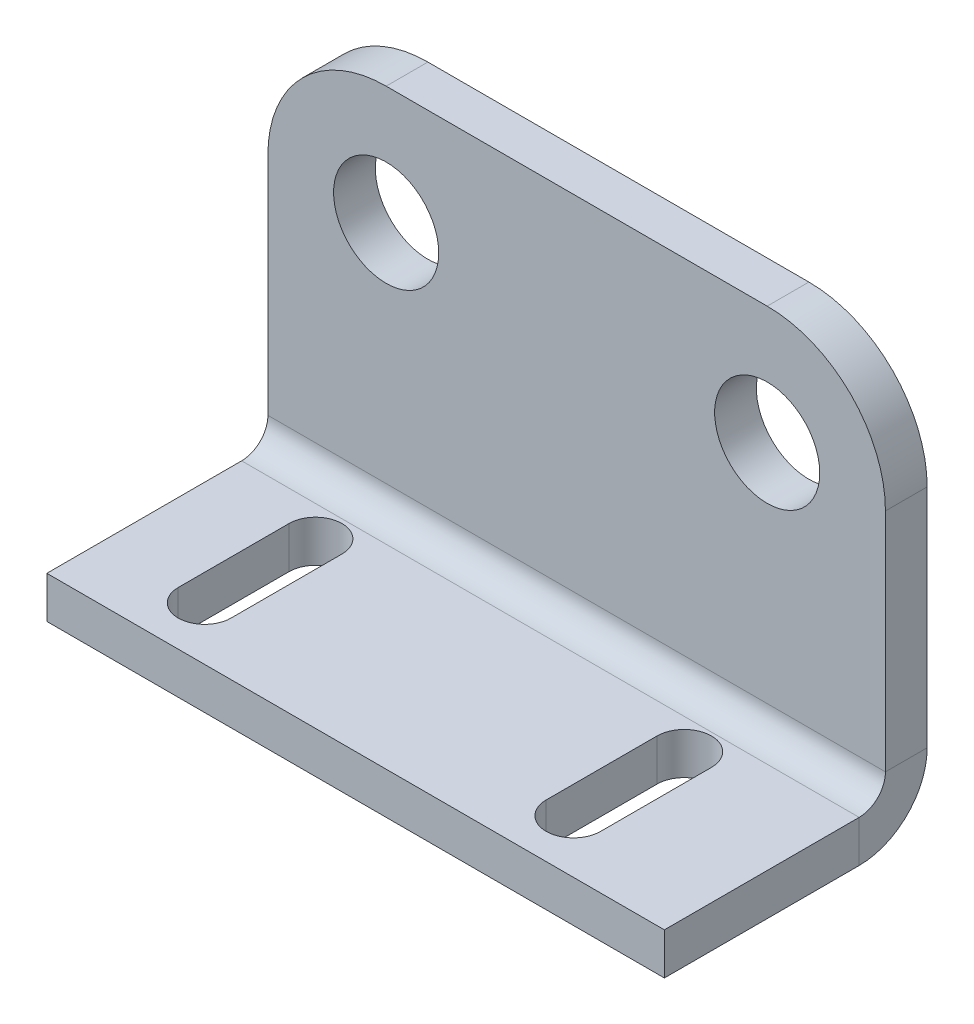
ISO-10303-21;
HEADER;
FILE_DESCRIPTION(('STEP AP214'),'2;1');
FILE_NAME('part.step','',(''),(''),'','','');
FILE_SCHEMA(('AUTOMOTIVE_DESIGN { 1 0 10303 214 1 1 1 1 }'));
ENDSEC;
DATA;
#1=APPLICATION_CONTEXT('core data for automotive mechanical design processes');
#2=APPLICATION_PROTOCOL_DEFINITION('international standard','automotive_design',2000,#1);
#3=PRODUCT_CONTEXT('',#1,'mechanical');
#4=PRODUCT('Part','Part','',(#3));
#5=PRODUCT_RELATED_PRODUCT_CATEGORY('part','',(#4));
#6=PRODUCT_DEFINITION_FORMATION('','',#4);
#7=PRODUCT_DEFINITION_CONTEXT('part definition',#1,'design');
#8=PRODUCT_DEFINITION('design','',#6,#7);
#9=PRODUCT_DEFINITION_SHAPE('','',#8);
#10=(LENGTH_UNIT() NAMED_UNIT(*) SI_UNIT(.MILLI.,.METRE.));
#11=(NAMED_UNIT(*) PLANE_ANGLE_UNIT() SI_UNIT($,.RADIAN.));
#12=(NAMED_UNIT(*) SI_UNIT($,.STERADIAN.) SOLID_ANGLE_UNIT());
#13=UNCERTAINTY_MEASURE_WITH_UNIT(LENGTH_MEASURE(1.E-05),#10,'distance_accuracy_value','');
#14=(GEOMETRIC_REPRESENTATION_CONTEXT(3) GLOBAL_UNCERTAINTY_ASSIGNED_CONTEXT((#13)) GLOBAL_UNIT_ASSIGNED_CONTEXT((#10,
#11,#12)) REPRESENTATION_CONTEXT('',''));
#15=CARTESIAN_POINT('',(0.,0.,0.));
#16=DIRECTION('',(0.,0.,1.));
#17=DIRECTION('',(1.,0.,0.));
#18=AXIS2_PLACEMENT_3D('',#15,#16,#17);
#19=CARTESIAN_POINT('',(31.2829174630816,-55.9298992856387,18.7536007121329));
#20=DIRECTION('',(0.,-1.,0.));
#21=DIRECTION('',(0.,0.,-1.));
#22=AXIS2_PLACEMENT_3D('',#19,#20,#21);
#23=CYLINDRICAL_SURFACE('',#22,5.18082831067459);
#24=DIRECTION('',(0.,-1.,0.));
#25=VECTOR('',#24,1.);
#26=CARTESIAN_POINT('',(36.4637457737562,-55.9298992856387,18.7536007121329));
#27=LINE('',#26,#25);
#28=CARTESIAN_POINT('',(36.4637457737562,-47.9923992856387,18.7536007121329));
#29=VERTEX_POINT('',#28);
#30=CARTESIAN_POINT('',(36.4637457737562,-55.9298992856387,18.7536007121329));
#31=VERTEX_POINT('',#30);
#32=EDGE_CURVE('E11',#29,#31,#27,.T.);
#33=ORIENTED_EDGE('',*,*,#32,.F.);
#34=CARTESIAN_POINT('',(31.2829174630816,-47.9923992856387,18.7536007121329));
#35=DIRECTION('',(0.,-1.,0.));
#36=DIRECTION('',(0.,0.,-1.));
#37=AXIS2_PLACEMENT_3D('',#34,#35,#36);
#38=CIRCLE('',#37,5.18082831067459);
#39=CARTESIAN_POINT('',(26.102089152407,-47.9923992856387,18.7536007121329));
#40=VERTEX_POINT('',#39);
#41=EDGE_CURVE('E141',#40,#29,#38,.T.);
#42=ORIENTED_EDGE('',*,*,#41,.F.);
#43=DIRECTION('',(0.,-1.,0.));
#44=VECTOR('',#43,1.);
#45=CARTESIAN_POINT('',(26.102089152407,-55.9298992856387,18.7536007121329));
#46=LINE('',#45,#44);
#47=CARTESIAN_POINT('',(26.102089152407,-55.9298992856387,18.7536007121329));
#48=VERTEX_POINT('',#47);
#49=EDGE_CURVE('E51',#40,#48,#46,.T.);
#50=ORIENTED_EDGE('',*,*,#49,.T.);
#51=CARTESIAN_POINT('',(31.2829174630816,-55.9298992856387,18.7536007121329));
#52=DIRECTION('',(0.,-1.,0.));
#53=DIRECTION('',(0.,0.,-1.));
#54=AXIS2_PLACEMENT_3D('',#51,#52,#53);
#55=CIRCLE('',#54,5.18082831067459);
#56=EDGE_CURVE('E202',#48,#31,#55,.T.);
#57=ORIENTED_EDGE('',*,*,#56,.T.);
#58=EDGE_LOOP('',(#33,#42,#50,#57));
#59=FACE_BOUND('',#58,.T.);
#60=ADVANCED_FACE('F41',(#59),#23,.F.);
#61=CARTESIAN_POINT('',(26.102089152407,-55.9298992856387,39.8450791079031));
#62=DIRECTION('',(1.,0.,0.));
#63=DIRECTION('',(0.,0.,-1.));
#64=AXIS2_PLACEMENT_3D('',#61,#62,#63);
#65=PLANE('',#64);
#66=ORIENTED_EDGE('',*,*,#49,.F.);
#67=DIRECTION('',(0.,0.,1.));
#68=VECTOR('',#67,1.);
#69=CARTESIAN_POINT('',(26.102089152407,-47.9923992856387,0.));
#70=LINE('',#69,#68);
#71=CARTESIAN_POINT('',(26.102089152407,-47.9923992856387,39.8450791079031));
#72=VERTEX_POINT('',#71);
#73=EDGE_CURVE('E154',#72,#40,#70,.F.);
#74=ORIENTED_EDGE('',*,*,#73,.F.);
#75=DIRECTION('',(0.,-1.,0.));
#76=VECTOR('',#75,1.);
#77=CARTESIAN_POINT('',(26.102089152407,-55.9298992856387,39.8450791079031));
#78=LINE('',#77,#76);
#79=CARTESIAN_POINT('',(26.102089152407,-55.9298992856387,39.8450791079031));
#80=VERTEX_POINT('',#79);
#81=EDGE_CURVE('E133',#72,#80,#78,.T.);
#82=ORIENTED_EDGE('',*,*,#81,.T.);
#83=DIRECTION('',(0.,0.,-1.));
#84=VECTOR('',#83,1.);
#85=CARTESIAN_POINT('',(26.102089152407,-55.9298992856387,39.8450791079031));
#86=LINE('',#85,#84);
#87=EDGE_CURVE('E210',#80,#48,#86,.T.);
#88=ORIENTED_EDGE('',*,*,#87,.T.);
#89=EDGE_LOOP('',(#66,#74,#82,#88));
#90=FACE_BOUND('',#89,.T.);
#91=ADVANCED_FACE('F212',(#90),#65,.T.);
#92=CARTESIAN_POINT('',(31.2829174630816,-55.9298992856387,39.8450791079031));
#93=DIRECTION('',(0.,-1.,0.));
#94=DIRECTION('',(0.,0.,-1.));
#95=AXIS2_PLACEMENT_3D('',#92,#93,#94);
#96=CYLINDRICAL_SURFACE('',#95,5.18082831067459);
#97=ORIENTED_EDGE('',*,*,#81,.F.);
#98=CARTESIAN_POINT('',(31.2829174630816,-47.9923992856387,39.8450791079031));
#99=DIRECTION('',(0.,-1.,0.));
#100=DIRECTION('',(0.,0.,-1.));
#101=AXIS2_PLACEMENT_3D('',#98,#99,#100);
#102=CIRCLE('',#101,5.18082831067459);
#103=CARTESIAN_POINT('',(36.4637457737562,-47.9923992856387,39.8450791079031));
#104=VERTEX_POINT('',#103);
#105=EDGE_CURVE('E139',#104,#72,#102,.T.);
#106=ORIENTED_EDGE('',*,*,#105,.F.);
#107=DIRECTION('',(0.,-1.,0.));
#108=VECTOR('',#107,1.);
#109=CARTESIAN_POINT('',(36.4637457737562,-55.9298992856387,39.8450791079031));
#110=LINE('',#109,#108);
#111=CARTESIAN_POINT('',(36.4637457737562,-55.9298992856387,39.8450791079031));
#112=VERTEX_POINT('',#111);
#113=EDGE_CURVE('E45',#104,#112,#110,.T.);
#114=ORIENTED_EDGE('',*,*,#113,.T.);
#115=CARTESIAN_POINT('',(31.2829174630816,-55.9298992856387,39.8450791079031));
#116=DIRECTION('',(0.,-1.,0.));
#117=DIRECTION('',(0.,0.,-1.));
#118=AXIS2_PLACEMENT_3D('',#115,#116,#117);
#119=CIRCLE('',#118,5.18082831067459);
#120=EDGE_CURVE('E382',#112,#80,#119,.T.);
#121=ORIENTED_EDGE('',*,*,#120,.T.);
#122=EDGE_LOOP('',(#97,#106,#114,#121));
#123=FACE_BOUND('',#122,.T.);
#124=ADVANCED_FACE('F143',(#123),#96,.F.);
#125=CARTESIAN_POINT('',(-38.8803002300545,-55.9298992856387,18.7536007121329));
#126=DIRECTION('',(0.,-1.,0.));
#127=DIRECTION('',(0.,0.,-1.));
#128=AXIS2_PLACEMENT_3D('',#125,#126,#127);
#129=CYLINDRICAL_SURFACE('',#128,5.03280464465532);
#130=DIRECTION('',(0.,-1.,0.));
#131=VECTOR('',#130,1.);
#132=CARTESIAN_POINT('',(-33.8474955853992,-55.9298992856387,18.7536007121329));
#133=LINE('',#132,#131);
#134=CARTESIAN_POINT('',(-33.8474955853992,-47.9923992856387,18.7536007121329));
#135=VERTEX_POINT('',#134);
#136=CARTESIAN_POINT('',(-33.8474955853992,-55.9298992856387,18.7536007121329));
#137=VERTEX_POINT('',#136);
#138=EDGE_CURVE('E134',#135,#137,#133,.T.);
#139=ORIENTED_EDGE('',*,*,#138,.F.);
#140=CARTESIAN_POINT('',(-38.8803002300545,-47.9923992856387,18.7536007121329));
#141=DIRECTION('',(0.,-1.,0.));
#142=DIRECTION('',(0.,0.,-1.));
#143=AXIS2_PLACEMENT_3D('',#140,#141,#142);
#144=CIRCLE('',#143,5.03280464465532);
#145=CARTESIAN_POINT('',(-43.9131048747098,-47.9923992856387,18.7536007121329));
#146=VERTEX_POINT('',#145);
#147=EDGE_CURVE('E289',#146,#135,#144,.T.);
#148=ORIENTED_EDGE('',*,*,#147,.F.);
#149=DIRECTION('',(0.,-1.,0.));
#150=VECTOR('',#149,1.);
#151=CARTESIAN_POINT('',(-43.9131048747098,-55.9298992856387,18.7536007121329));
#152=LINE('',#151,#150);
#153=CARTESIAN_POINT('',(-43.9131048747098,-55.9298992856387,18.7536007121329));
#154=VERTEX_POINT('',#153);
#155=EDGE_CURVE('E190',#146,#154,#152,.T.);
#156=ORIENTED_EDGE('',*,*,#155,.T.);
#157=CARTESIAN_POINT('',(-38.8803002300545,-55.9298992856387,18.7536007121329));
#158=DIRECTION('',(0.,-1.,0.));
#159=DIRECTION('',(0.,0.,-1.));
#160=AXIS2_PLACEMENT_3D('',#157,#158,#159);
#161=CIRCLE('',#160,5.03280464465532);
#162=EDGE_CURVE('E387',#154,#137,#161,.T.);
#163=ORIENTED_EDGE('',*,*,#162,.T.);
#164=EDGE_LOOP('',(#139,#148,#156,#163));
#165=FACE_BOUND('',#164,.T.);
#166=ADVANCED_FACE('F399',(#165),#129,.F.);
#167=CARTESIAN_POINT('',(-43.9131048747098,-55.9298992856387,39.8450791079031));
#168=DIRECTION('',(1.,0.,0.));
#169=DIRECTION('',(0.,0.,-1.));
#170=AXIS2_PLACEMENT_3D('',#167,#168,#169);
#171=PLANE('',#170);
#172=ORIENTED_EDGE('',*,*,#155,.F.);
#173=DIRECTION('',(0.,0.,1.));
#174=VECTOR('',#173,1.);
#175=CARTESIAN_POINT('',(-43.9131048747098,-47.9923992856387,0.));
#176=LINE('',#175,#174);
#177=CARTESIAN_POINT('',(-43.9131048747098,-47.9923992856387,39.8450791079031));
#178=VERTEX_POINT('',#177);
#179=EDGE_CURVE('E276',#178,#146,#176,.F.);
#180=ORIENTED_EDGE('',*,*,#179,.F.);
#181=DIRECTION('',(0.,-1.,0.));
#182=VECTOR('',#181,1.);
#183=CARTESIAN_POINT('',(-43.9131048747098,-55.9298992856387,39.8450791079031));
#184=LINE('',#183,#182);
#185=CARTESIAN_POINT('',(-43.9131048747098,-55.9298992856387,39.8450791079031));
#186=VERTEX_POINT('',#185);
#187=EDGE_CURVE('E187',#178,#186,#184,.T.);
#188=ORIENTED_EDGE('',*,*,#187,.T.);
#189=DIRECTION('',(0.,0.,-1.));
#190=VECTOR('',#189,1.);
#191=CARTESIAN_POINT('',(-43.9131048747098,-55.9298992856387,39.8450791079031));
#192=LINE('',#191,#190);
#193=EDGE_CURVE('E309',#186,#154,#192,.T.);
#194=ORIENTED_EDGE('',*,*,#193,.T.);
#195=EDGE_LOOP('',(#172,#180,#188,#194));
#196=FACE_BOUND('',#195,.T.);
#197=ADVANCED_FACE('F307',(#196),#171,.T.);
#198=CARTESIAN_POINT('',(-38.8803002300545,-55.9298992856387,39.8450791079031));
#199=DIRECTION('',(0.,-1.,0.));
#200=DIRECTION('',(0.,0.,-1.));
#201=AXIS2_PLACEMENT_3D('',#198,#199,#200);
#202=CYLINDRICAL_SURFACE('',#201,5.03280464465532);
#203=ORIENTED_EDGE('',*,*,#187,.F.);
#204=CARTESIAN_POINT('',(-38.8803002300545,-47.9923992856387,39.8450791079031));
#205=DIRECTION('',(0.,-1.,0.));
#206=DIRECTION('',(0.,0.,-1.));
#207=AXIS2_PLACEMENT_3D('',#204,#205,#206);
#208=CIRCLE('',#207,5.03280464465532);
#209=CARTESIAN_POINT('',(-33.8474955853992,-47.9923992856387,39.8450791079031));
#210=VERTEX_POINT('',#209);
#211=EDGE_CURVE('E272',#210,#178,#208,.T.);
#212=ORIENTED_EDGE('',*,*,#211,.F.);
#213=DIRECTION('',(0.,-1.,0.));
#214=VECTOR('',#213,1.);
#215=CARTESIAN_POINT('',(-33.8474955853992,-55.9298992856387,39.8450791079031));
#216=LINE('',#215,#214);
#217=CARTESIAN_POINT('',(-33.8474955853992,-55.9298992856387,39.8450791079031));
#218=VERTEX_POINT('',#217);
#219=EDGE_CURVE('E184',#210,#218,#216,.T.);
#220=ORIENTED_EDGE('',*,*,#219,.T.);
#221=CARTESIAN_POINT('',(-38.8803002300545,-55.9298992856387,39.8450791079031));
#222=DIRECTION('',(0.,-1.,0.));
#223=DIRECTION('',(0.,0.,-1.));
#224=AXIS2_PLACEMENT_3D('',#221,#222,#223);
#225=CIRCLE('',#224,5.03280464465532);
#226=EDGE_CURVE('E248',#218,#186,#225,.T.);
#227=ORIENTED_EDGE('',*,*,#226,.T.);
#228=EDGE_LOOP('',(#203,#212,#220,#227));
#229=FACE_BOUND('',#228,.T.);
#230=ADVANCED_FACE('F300',(#229),#202,.F.);
#231=CARTESIAN_POINT('',(58.75,-55.9298992856387,0.));
#232=DIRECTION('',(-1.,0.,0.));
#233=DIRECTION('',(0.,0.,1.));
#234=AXIS2_PLACEMENT_3D('',#231,#232,#233);
#235=PLANE('',#234);
#236=DIRECTION('',(0.,-1.,0.));
#237=VECTOR('',#236,1.);
#238=CARTESIAN_POINT('',(58.75,-55.9298992856387,12.9375));
#239=LINE('',#238,#237);
#240=CARTESIAN_POINT('',(58.75,-47.9923992856387,12.9375));
#241=VERTEX_POINT('',#240);
#242=CARTESIAN_POINT('',(58.75,-55.9298992856387,12.9375));
#243=VERTEX_POINT('',#242);
#244=EDGE_CURVE('E181',#241,#243,#239,.T.);
#245=ORIENTED_EDGE('',*,*,#244,.F.);
#246=DIRECTION('',(0.,0.,1.));
#247=VECTOR('',#246,1.);
#248=CARTESIAN_POINT('',(58.75,-47.9923992856387,0.));
#249=LINE('',#248,#247);
#250=CARTESIAN_POINT('',(58.75,-47.9923992856387,50.));
#251=VERTEX_POINT('',#250);
#252=EDGE_CURVE('E148',#241,#251,#249,.T.);
#253=ORIENTED_EDGE('',*,*,#252,.T.);
#254=DIRECTION('',(0.,-1.,0.));
#255=VECTOR('',#254,1.);
#256=CARTESIAN_POINT('',(58.75,-55.9298992856387,50.));
#257=LINE('',#256,#255);
#258=CARTESIAN_POINT('',(58.75,-55.9298992856387,50.));
#259=VERTEX_POINT('',#258);
#260=EDGE_CURVE('E178',#251,#259,#257,.T.);
#261=ORIENTED_EDGE('',*,*,#260,.T.);
#262=DIRECTION('',(0.,0.,1.));
#263=VECTOR('',#262,1.);
#264=CARTESIAN_POINT('',(58.75,-55.9298992856387,0.));
#265=LINE('',#264,#263);
#266=EDGE_CURVE('E342',#243,#259,#265,.T.);
#267=ORIENTED_EDGE('',*,*,#266,.F.);
#268=EDGE_LOOP('',(#245,#253,#261,#267));
#269=FACE_BOUND('',#268,.T.);
#270=ADVANCED_FACE('F343',(#269),#235,.F.);
#271=CARTESIAN_POINT('',(-58.75,-55.9298992856387,50.));
#272=DIRECTION('',(0.,0.,-1.));
#273=DIRECTION('',(-1.,0.,0.));
#274=AXIS2_PLACEMENT_3D('',#271,#272,#273);
#275=PLANE('',#274);
#276=ORIENTED_EDGE('',*,*,#260,.F.);
#277=DIRECTION('',(1.,0.,0.));
#278=VECTOR('',#277,1.);
#279=CARTESIAN_POINT('',(0.,-47.9923992856387,50.));
#280=LINE('',#279,#278);
#281=CARTESIAN_POINT('',(-58.75,-47.9923992856387,50.));
#282=VERTEX_POINT('',#281);
#283=EDGE_CURVE('E145',#251,#282,#280,.F.);
#284=ORIENTED_EDGE('',*,*,#283,.T.);
#285=DIRECTION('',(0.,-1.,0.));
#286=VECTOR('',#285,1.);
#287=CARTESIAN_POINT('',(-58.75,-55.9298992856387,50.));
#288=LINE('',#287,#286);
#289=CARTESIAN_POINT('',(-58.75,-55.9298992856387,50.));
#290=VERTEX_POINT('',#289);
#291=EDGE_CURVE('E175',#282,#290,#288,.T.);
#292=ORIENTED_EDGE('',*,*,#291,.T.);
#293=DIRECTION('',(-1.,0.,0.));
#294=VECTOR('',#293,1.);
#295=CARTESIAN_POINT('',(-58.75,-55.9298992856387,50.));
#296=LINE('',#295,#294);
#297=EDGE_CURVE('E347',#259,#290,#296,.T.);
#298=ORIENTED_EDGE('',*,*,#297,.F.);
#299=EDGE_LOOP('',(#276,#284,#292,#298));
#300=FACE_BOUND('',#299,.T.);
#301=ADVANCED_FACE('F381',(#300),#275,.F.);
#302=CARTESIAN_POINT('',(-58.75,-55.9298992856387,0.));
#303=DIRECTION('',(1.,0.,0.));
#304=DIRECTION('',(0.,0.,-1.));
#305=AXIS2_PLACEMENT_3D('',#302,#303,#304);
#306=PLANE('',#305);
#307=ORIENTED_EDGE('',*,*,#291,.F.);
#308=DIRECTION('',(0.,0.,1.));
#309=VECTOR('',#308,1.);
#310=CARTESIAN_POINT('',(-58.75,-47.9923992856387,0.));
#311=LINE('',#310,#309);
#312=CARTESIAN_POINT('',(-58.75,-47.9923992856387,12.9375));
#313=VERTEX_POINT('',#312);
#314=EDGE_CURVE('E274',#282,#313,#311,.F.);
#315=ORIENTED_EDGE('',*,*,#314,.T.);
#316=DIRECTION('',(0.,-1.,0.));
#317=VECTOR('',#316,1.);
#318=CARTESIAN_POINT('',(-58.75,-55.9298992856387,12.9375));
#319=LINE('',#318,#317);
#320=CARTESIAN_POINT('',(-58.75,-55.9298992856387,12.9375));
#321=VERTEX_POINT('',#320);
#322=EDGE_CURVE('E172',#313,#321,#319,.T.);
#323=ORIENTED_EDGE('',*,*,#322,.T.);
#324=DIRECTION('',(0.,0.,-1.));
#325=VECTOR('',#324,1.);
#326=CARTESIAN_POINT('',(-58.75,-55.9298992856387,0.));
#327=LINE('',#326,#325);
#328=EDGE_CURVE('E348',#290,#321,#327,.T.);
#329=ORIENTED_EDGE('',*,*,#328,.F.);
#330=EDGE_LOOP('',(#307,#315,#323,#329));
#331=FACE_BOUND('',#330,.T.);
#332=ADVANCED_FACE('F441',(#331),#306,.F.);
#333=CARTESIAN_POINT('',(-58.75,-42.9923992856387,12.9375));
#334=DIRECTION('',(-1.,0.,0.));
#335=DIRECTION('',(0.,-1.,0.));
#336=AXIS2_PLACEMENT_3D('',#333,#334,#335);
#337=PLANE('',#336);
#338=ORIENTED_EDGE('',*,*,#322,.F.);
#339=CARTESIAN_POINT('',(-58.75,-42.9923992856387,12.9375));
#340=DIRECTION('',(1.,0.,0.));
#341=DIRECTION('',(0.,0.,-1.));
#342=AXIS2_PLACEMENT_3D('',#339,#340,#341);
#343=CIRCLE('',#342,5.);
#344=CARTESIAN_POINT('',(-58.75,-42.9923992856387,7.9375));
#345=VERTEX_POINT('',#344);
#346=EDGE_CURVE('E270',#313,#345,#343,.T.);
#347=ORIENTED_EDGE('',*,*,#346,.T.);
#348=DIRECTION('',(0.,0.,-1.));
#349=VECTOR('',#348,1.);
#350=CARTESIAN_POINT('',(-58.75,-42.9923992856387,0.));
#351=LINE('',#350,#349);
#352=CARTESIAN_POINT('',(-58.75,-42.9923992856387,0.));
#353=VERTEX_POINT('',#352);
#354=EDGE_CURVE('E59',#345,#353,#351,.T.);
#355=ORIENTED_EDGE('',*,*,#354,.T.);
#356=CARTESIAN_POINT('',(-58.75,-42.9923992856387,12.9375));
#357=DIRECTION('',(1.,0.,0.));
#358=DIRECTION('',(0.,1.,0.));
#359=AXIS2_PLACEMENT_3D('',#356,#357,#358);
#360=CIRCLE('',#359,12.9375);
#361=EDGE_CURVE('E245',#321,#353,#360,.T.);
#362=ORIENTED_EDGE('',*,*,#361,.F.);
#363=EDGE_LOOP('',(#338,#347,#355,#362));
#364=FACE_BOUND('',#363,.T.);
#365=ADVANCED_FACE('F354',(#364),#337,.T.);
#366=CARTESIAN_POINT('',(-58.75,0.,0.));
#367=DIRECTION('',(-1.,0.,0.));
#368=DIRECTION('',(0.,-1.,0.));
#369=AXIS2_PLACEMENT_3D('',#366,#367,#368);
#370=PLANE('',#369);
#371=ORIENTED_EDGE('',*,*,#354,.F.);
#372=DIRECTION('',(0.,1.,0.));
#373=VECTOR('',#372,1.);
#374=CARTESIAN_POINT('',(-58.75,0.,7.9375));
#375=LINE('',#374,#373);
#376=CARTESIAN_POINT('',(-58.75,0.,7.9375));
#377=VERTEX_POINT('',#376);
#378=EDGE_CURVE('E258',#377,#345,#375,.F.);
#379=ORIENTED_EDGE('',*,*,#378,.F.);
#380=DIRECTION('',(0.,0.,-1.));
#381=VECTOR('',#380,1.);
#382=CARTESIAN_POINT('',(-58.75,0.,0.));
#383=LINE('',#382,#381);
#384=CARTESIAN_POINT('',(-58.75,0.,0.));
#385=VERTEX_POINT('',#384);
#386=EDGE_CURVE('E168',#377,#385,#383,.T.);
#387=ORIENTED_EDGE('',*,*,#386,.T.);
#388=DIRECTION('',(0.,-1.,0.));
#389=VECTOR('',#388,1.);
#390=CARTESIAN_POINT('',(-58.75,0.,0.));
#391=LINE('',#390,#389);
#392=EDGE_CURVE('E225',#385,#353,#391,.T.);
#393=ORIENTED_EDGE('',*,*,#392,.T.);
#394=EDGE_LOOP('',(#371,#379,#387,#393));
#395=FACE_BOUND('',#394,.T.);
#396=ADVANCED_FACE('F358',(#395),#370,.T.);
#397=CARTESIAN_POINT('',(-36.25,0.,0.));
#398=DIRECTION('',(0.,0.,1.));
#399=DIRECTION('',(1.,0.,0.));
#400=AXIS2_PLACEMENT_3D('',#397,#398,#399);
#401=CYLINDRICAL_SURFACE('',#400,22.5);
#402=ORIENTED_EDGE('',*,*,#386,.F.);
#403=CARTESIAN_POINT('',(-36.25,0.,7.9375));
#404=DIRECTION('',(0.,0.,1.));
#405=DIRECTION('',(1.,0.,0.));
#406=AXIS2_PLACEMENT_3D('',#403,#404,#405);
#407=CIRCLE('',#406,22.5);
#408=CARTESIAN_POINT('',(-36.25,22.5,7.9375));
#409=VERTEX_POINT('',#408);
#410=EDGE_CURVE('E264',#409,#377,#407,.T.);
#411=ORIENTED_EDGE('',*,*,#410,.F.);
#412=DIRECTION('',(0.,0.,-1.));
#413=VECTOR('',#412,1.);
#414=CARTESIAN_POINT('',(-36.25,22.5,0.));
#415=LINE('',#414,#413);
#416=CARTESIAN_POINT('',(-36.25,22.5,0.));
#417=VERTEX_POINT('',#416);
#418=EDGE_CURVE('E165',#409,#417,#415,.T.);
#419=ORIENTED_EDGE('',*,*,#418,.T.);
#420=CARTESIAN_POINT('',(-36.25,0.,0.));
#421=DIRECTION('',(0.,0.,1.));
#422=DIRECTION('',(1.,0.,0.));
#423=AXIS2_PLACEMENT_3D('',#420,#421,#422);
#424=CIRCLE('',#423,22.5);
#425=EDGE_CURVE('E228',#417,#385,#424,.T.);
#426=ORIENTED_EDGE('',*,*,#425,.T.);
#427=EDGE_LOOP('',(#402,#411,#419,#426));
#428=FACE_BOUND('',#427,.T.);
#429=ADVANCED_FACE('F432',(#428),#401,.T.);
#430=CARTESIAN_POINT('',(0.,22.5,0.));
#431=DIRECTION('',(0.,-1.,0.));
#432=DIRECTION('',(1.,0.,0.));
#433=AXIS2_PLACEMENT_3D('',#430,#431,#432);
#434=PLANE('',#433);
#435=ORIENTED_EDGE('',*,*,#418,.F.);
#436=DIRECTION('',(1.,0.,0.));
#437=VECTOR('',#436,1.);
#438=CARTESIAN_POINT('',(0.,22.5,7.9375));
#439=LINE('',#438,#437);
#440=CARTESIAN_POINT('',(36.25,22.5,7.9375));
#441=VERTEX_POINT('',#440);
#442=EDGE_CURVE('E156',#409,#441,#439,.T.);
#443=ORIENTED_EDGE('',*,*,#442,.T.);
#444=DIRECTION('',(0.,0.,-1.));
#445=VECTOR('',#444,1.);
#446=CARTESIAN_POINT('',(36.25,22.5,0.));
#447=LINE('',#446,#445);
#448=CARTESIAN_POINT('',(36.25,22.5,0.));
#449=VERTEX_POINT('',#448);
#450=EDGE_CURVE('E161',#441,#449,#447,.T.);
#451=ORIENTED_EDGE('',*,*,#450,.T.);
#452=DIRECTION('',(1.,0.,0.));
#453=VECTOR('',#452,1.);
#454=CARTESIAN_POINT('',(0.,22.5,0.));
#455=LINE('',#454,#453);
#456=EDGE_CURVE('E213',#417,#449,#455,.T.);
#457=ORIENTED_EDGE('',*,*,#456,.F.);
#458=EDGE_LOOP('',(#435,#443,#451,#457));
#459=FACE_BOUND('',#458,.T.);
#460=ADVANCED_FACE('F424',(#459),#434,.F.);
#461=CARTESIAN_POINT('',(36.25,0.,0.));
#462=DIRECTION('',(0.,0.,1.));
#463=DIRECTION('',(1.,0.,0.));
#464=AXIS2_PLACEMENT_3D('',#461,#462,#463);
#465=CYLINDRICAL_SURFACE('',#464,22.5);
#466=ORIENTED_EDGE('',*,*,#450,.F.);
#467=CARTESIAN_POINT('',(36.25,0.,7.9375));
#468=DIRECTION('',(0.,0.,1.));
#469=DIRECTION('',(1.,0.,0.));
#470=AXIS2_PLACEMENT_3D('',#467,#468,#469);
#471=CIRCLE('',#470,22.5);
#472=CARTESIAN_POINT('',(58.75,0.,7.9375));
#473=VERTEX_POINT('',#472);
#474=EDGE_CURVE('E259',#473,#441,#471,.T.);
#475=ORIENTED_EDGE('',*,*,#474,.F.);
#476=DIRECTION('',(0.,0.,-1.));
#477=VECTOR('',#476,1.);
#478=CARTESIAN_POINT('',(58.75,0.,0.));
#479=LINE('',#478,#477);
#480=CARTESIAN_POINT('',(58.75,0.,0.));
#481=VERTEX_POINT('',#480);
#482=EDGE_CURVE('E158',#473,#481,#479,.T.);
#483=ORIENTED_EDGE('',*,*,#482,.T.);
#484=CARTESIAN_POINT('',(36.25,0.,0.));
#485=DIRECTION('',(0.,0.,1.));
#486=DIRECTION('',(1.,0.,0.));
#487=AXIS2_PLACEMENT_3D('',#484,#485,#486);
#488=CIRCLE('',#487,22.5);
#489=EDGE_CURVE('E216',#481,#449,#488,.T.);
#490=ORIENTED_EDGE('',*,*,#489,.T.);
#491=EDGE_LOOP('',(#466,#475,#483,#490));
#492=FACE_BOUND('',#491,.T.);
#493=ADVANCED_FACE('F419',(#492),#465,.T.);
#494=CARTESIAN_POINT('',(58.75,0.,0.));
#495=DIRECTION('',(-1.,0.,0.));
#496=DIRECTION('',(0.,-1.,0.));
#497=AXIS2_PLACEMENT_3D('',#494,#495,#496);
#498=PLANE('',#497);
#499=ORIENTED_EDGE('',*,*,#482,.F.);
#500=DIRECTION('',(0.,1.,0.));
#501=VECTOR('',#500,1.);
#502=CARTESIAN_POINT('',(58.75,0.,7.9375));
#503=LINE('',#502,#501);
#504=CARTESIAN_POINT('',(58.75,-42.9923992856387,7.9375));
#505=VERTEX_POINT('',#504);
#506=EDGE_CURVE('E255',#473,#505,#503,.F.);
#507=ORIENTED_EDGE('',*,*,#506,.T.);
#508=DIRECTION('',(0.,0.,-1.));
#509=VECTOR('',#508,1.);
#510=CARTESIAN_POINT('',(58.75,-42.9923992856387,0.));
#511=LINE('',#510,#509);
#512=CARTESIAN_POINT('',(58.75,-42.9923992856387,0.));
#513=VERTEX_POINT('',#512);
#514=EDGE_CURVE('E162',#505,#513,#511,.T.);
#515=ORIENTED_EDGE('',*,*,#514,.T.);
#516=DIRECTION('',(0.,-1.,0.));
#517=VECTOR('',#516,1.);
#518=CARTESIAN_POINT('',(58.75,0.,0.));
#519=LINE('',#518,#517);
#520=EDGE_CURVE('E222',#481,#513,#519,.T.);
#521=ORIENTED_EDGE('',*,*,#520,.F.);
#522=EDGE_LOOP('',(#499,#507,#515,#521));
#523=FACE_BOUND('',#522,.T.);
#524=ADVANCED_FACE('F367',(#523),#498,.F.);
#525=CARTESIAN_POINT('',(-33.8474955853992,-55.9298992856387,39.8450791079031));
#526=DIRECTION('',(-1.,0.,0.));
#527=DIRECTION('',(0.,0.,1.));
#528=AXIS2_PLACEMENT_3D('',#525,#526,#527);
#529=PLANE('',#528);
#530=DIRECTION('',(0.,0.,1.));
#531=VECTOR('',#530,1.);
#532=CARTESIAN_POINT('',(-33.8474955853992,-47.9923992856387,0.));
#533=LINE('',#532,#531);
#534=EDGE_CURVE('E152',#135,#210,#533,.T.);
#535=ORIENTED_EDGE('',*,*,#534,.F.);
#536=ORIENTED_EDGE('',*,*,#138,.T.);
#537=DIRECTION('',(0.,0.,1.));
#538=VECTOR('',#537,1.);
#539=CARTESIAN_POINT('',(-33.8474955853992,-55.9298992856387,39.8450791079031));
#540=LINE('',#539,#538);
#541=EDGE_CURVE('E390',#137,#218,#540,.T.);
#542=ORIENTED_EDGE('',*,*,#541,.T.);
#543=ORIENTED_EDGE('',*,*,#219,.F.);
#544=EDGE_LOOP('',(#535,#536,#542,#543));
#545=FACE_BOUND('',#544,.T.);
#546=ADVANCED_FACE('F394',(#545),#529,.T.);
#547=CARTESIAN_POINT('',(36.4637457737562,-55.9298992856387,39.8450791079031));
#548=DIRECTION('',(-1.,0.,0.));
#549=DIRECTION('',(0.,0.,1.));
#550=AXIS2_PLACEMENT_3D('',#547,#548,#549);
#551=PLANE('',#550);
#552=DIRECTION('',(0.,0.,1.));
#553=VECTOR('',#552,1.);
#554=CARTESIAN_POINT('',(36.4637457737562,-47.9923992856387,0.));
#555=LINE('',#554,#553);
#556=EDGE_CURVE('E125',#29,#104,#555,.T.);
#557=ORIENTED_EDGE('',*,*,#556,.F.);
#558=ORIENTED_EDGE('',*,*,#32,.T.);
#559=DIRECTION('',(0.,0.,1.));
#560=VECTOR('',#559,1.);
#561=CARTESIAN_POINT('',(36.4637457737562,-55.9298992856387,39.8450791079031));
#562=LINE('',#561,#560);
#563=EDGE_CURVE('E128',#31,#112,#562,.T.);
#564=ORIENTED_EDGE('',*,*,#563,.T.);
#565=ORIENTED_EDGE('',*,*,#113,.F.);
#566=EDGE_LOOP('',(#557,#558,#564,#565));
#567=FACE_BOUND('',#566,.T.);
#568=ADVANCED_FACE('F43',(#567),#551,.T.);
#569=CARTESIAN_POINT('',(58.75,-42.9923992856387,12.9375));
#570=DIRECTION('',(-1.,0.,0.));
#571=DIRECTION('',(0.,-1.,0.));
#572=AXIS2_PLACEMENT_3D('',#569,#570,#571);
#573=PLANE('',#572);
#574=CARTESIAN_POINT('',(58.75,-42.9923992856387,12.9375));
#575=DIRECTION('',(1.,0.,0.));
#576=DIRECTION('',(0.,0.,-1.));
#577=AXIS2_PLACEMENT_3D('',#574,#575,#576);
#578=CIRCLE('',#577,5.);
#579=EDGE_CURVE('E273',#505,#241,#578,.F.);
#580=ORIENTED_EDGE('',*,*,#579,.T.);
#581=ORIENTED_EDGE('',*,*,#244,.T.);
#582=CARTESIAN_POINT('',(58.75,-42.9923992856387,12.9375));
#583=DIRECTION('',(1.,0.,0.));
#584=DIRECTION('',(0.,1.,0.));
#585=AXIS2_PLACEMENT_3D('',#582,#583,#584);
#586=CIRCLE('',#585,12.9375);
#587=EDGE_CURVE('E242',#513,#243,#586,.F.);
#588=ORIENTED_EDGE('',*,*,#587,.F.);
#589=ORIENTED_EDGE('',*,*,#514,.F.);
#590=EDGE_LOOP('',(#580,#581,#588,#589));
#591=FACE_BOUND('',#590,.T.);
#592=ADVANCED_FACE('F333',(#591),#573,.F.);
#593=CARTESIAN_POINT('',(36.25,0.,0.));
#594=DIRECTION('',(0.,0.,1.));
#595=DIRECTION('',(1.,0.,0.));
#596=AXIS2_PLACEMENT_3D('',#593,#594,#595);
#597=CYLINDRICAL_SURFACE('',#596,10.);
#598=CARTESIAN_POINT('',(36.25,0.,0.));
#599=DIRECTION('',(0.,0.,1.));
#600=DIRECTION('',(1.,0.,0.));
#601=AXIS2_PLACEMENT_3D('',#598,#599,#600);
#602=CIRCLE('',#601,10.);
#603=CARTESIAN_POINT('',(46.25,0.,0.));
#604=VERTEX_POINT('',#603);
#605=EDGE_CURVE('E231',#604,#604,#602,.T.);
#606=ORIENTED_EDGE('',*,*,#605,.F.);
#607=EDGE_LOOP('',(#606));
#608=FACE_BOUND('',#607,.T.);
#609=CARTESIAN_POINT('',(36.25,0.,7.9375));
#610=DIRECTION('',(0.,0.,1.));
#611=DIRECTION('',(1.,0.,0.));
#612=AXIS2_PLACEMENT_3D('',#609,#610,#611);
#613=CIRCLE('',#612,10.);
#614=CARTESIAN_POINT('',(46.25,0.,7.9375));
#615=VERTEX_POINT('',#614);
#616=EDGE_CURVE('E267',#615,#615,#613,.T.);
#617=ORIENTED_EDGE('',*,*,#616,.T.);
#618=EDGE_LOOP('',(#617));
#619=FACE_BOUND('',#618,.T.);
#620=ADVANCED_FACE('F450',(#608,#619),#597,.F.);
#621=CARTESIAN_POINT('',(-36.25,0.,0.));
#622=DIRECTION('',(0.,0.,1.));
#623=DIRECTION('',(1.,0.,0.));
#624=AXIS2_PLACEMENT_3D('',#621,#622,#623);
#625=CYLINDRICAL_SURFACE('',#624,10.);
#626=CARTESIAN_POINT('',(-36.25,0.,0.));
#627=DIRECTION('',(0.,0.,1.));
#628=DIRECTION('',(1.,0.,0.));
#629=AXIS2_PLACEMENT_3D('',#626,#627,#628);
#630=CIRCLE('',#629,10.);
#631=CARTESIAN_POINT('',(-26.25,0.,0.));
#632=VERTEX_POINT('',#631);
#633=EDGE_CURVE('E234',#632,#632,#630,.T.);
#634=ORIENTED_EDGE('',*,*,#633,.F.);
#635=EDGE_LOOP('',(#634));
#636=FACE_BOUND('',#635,.T.);
#637=CARTESIAN_POINT('',(-36.25,0.,7.9375));
#638=DIRECTION('',(0.,0.,1.));
#639=DIRECTION('',(1.,0.,0.));
#640=AXIS2_PLACEMENT_3D('',#637,#638,#639);
#641=CIRCLE('',#640,10.);
#642=CARTESIAN_POINT('',(-26.25,0.,7.9375));
#643=VERTEX_POINT('',#642);
#644=EDGE_CURVE('E254',#643,#643,#641,.T.);
#645=ORIENTED_EDGE('',*,*,#644,.T.);
#646=EDGE_LOOP('',(#645));
#647=FACE_BOUND('',#646,.T.);
#648=ADVANCED_FACE('F453',(#636,#647),#625,.F.);
#649=CARTESIAN_POINT('',(0.,0.,0.));
#650=DIRECTION('',(0.,0.,1.));
#651=DIRECTION('',(1.,0.,0.));
#652=AXIS2_PLACEMENT_3D('',#649,#650,#651);
#653=PLANE('',#652);
#654=ORIENTED_EDGE('',*,*,#520,.T.);
#655=DIRECTION('',(1.,0.,0.));
#656=VECTOR('',#655,1.);
#657=CARTESIAN_POINT('',(0.,-42.9923992856387,0.));
#658=LINE('',#657,#656);
#659=EDGE_CURVE('E186',#513,#353,#658,.F.);
#660=ORIENTED_EDGE('',*,*,#659,.T.);
#661=ORIENTED_EDGE('',*,*,#392,.F.);
#662=ORIENTED_EDGE('',*,*,#425,.F.);
#663=ORIENTED_EDGE('',*,*,#456,.T.);
#664=ORIENTED_EDGE('',*,*,#489,.F.);
#665=EDGE_LOOP('',(#654,#660,#661,#662,#663,#664));
#666=FACE_BOUND('',#665,.T.);
#667=ORIENTED_EDGE('',*,*,#605,.T.);
#668=EDGE_LOOP('',(#667));
#669=FACE_BOUND('',#668,.T.);
#670=ORIENTED_EDGE('',*,*,#633,.T.);
#671=EDGE_LOOP('',(#670));
#672=FACE_BOUND('',#671,.T.);
#673=ADVANCED_FACE('F362',(#666,#669,#672),#653,.F.);
#674=CARTESIAN_POINT('',(0.,-55.9298992856387,0.));
#675=DIRECTION('',(0.,1.,0.));
#676=DIRECTION('',(0.,0.,1.));
#677=AXIS2_PLACEMENT_3D('',#674,#675,#676);
#678=PLANE('',#677);
#679=ORIENTED_EDGE('',*,*,#226,.F.);
#680=ORIENTED_EDGE('',*,*,#541,.F.);
#681=ORIENTED_EDGE('',*,*,#162,.F.);
#682=ORIENTED_EDGE('',*,*,#193,.F.);
#683=EDGE_LOOP('',(#679,#680,#681,#682));
#684=FACE_BOUND('',#683,.T.);
#685=ORIENTED_EDGE('',*,*,#328,.T.);
#686=DIRECTION('',(1.,0.,0.));
#687=VECTOR('',#686,1.);
#688=CARTESIAN_POINT('',(0.,-55.9298992856387,12.9375));
#689=LINE('',#688,#687);
#690=EDGE_CURVE('E237',#321,#243,#689,.T.);
#691=ORIENTED_EDGE('',*,*,#690,.T.);
#692=ORIENTED_EDGE('',*,*,#266,.T.);
#693=ORIENTED_EDGE('',*,*,#297,.T.);
#694=EDGE_LOOP('',(#685,#691,#692,#693));
#695=FACE_BOUND('',#694,.T.);
#696=ORIENTED_EDGE('',*,*,#120,.F.);
#697=ORIENTED_EDGE('',*,*,#563,.F.);
#698=ORIENTED_EDGE('',*,*,#56,.F.);
#699=ORIENTED_EDGE('',*,*,#87,.F.);
#700=EDGE_LOOP('',(#696,#697,#698,#699));
#701=FACE_BOUND('',#700,.T.);
#702=ADVANCED_FACE('F209',(#684,#695,#701),#678,.F.);
#703=CARTESIAN_POINT('',(0.,-42.9923992856387,12.9375));
#704=DIRECTION('',(1.,0.,0.));
#705=DIRECTION('',(0.,0.,-1.));
#706=AXIS2_PLACEMENT_3D('',#703,#704,#705);
#707=CYLINDRICAL_SURFACE('',#706,12.9375);
#708=ORIENTED_EDGE('',*,*,#361,.T.);
#709=ORIENTED_EDGE('',*,*,#659,.F.);
#710=ORIENTED_EDGE('',*,*,#587,.T.);
#711=ORIENTED_EDGE('',*,*,#690,.F.);
#712=EDGE_LOOP('',(#708,#709,#710,#711));
#713=FACE_BOUND('',#712,.T.);
#714=ADVANCED_FACE('F340',(#713),#707,.T.);
#715=CARTESIAN_POINT('',(0.,0.,7.9375));
#716=DIRECTION('',(0.,0.,1.));
#717=DIRECTION('',(1.,0.,0.));
#718=AXIS2_PLACEMENT_3D('',#715,#716,#717);
#719=PLANE('',#718);
#720=ORIENTED_EDGE('',*,*,#506,.F.);
#721=ORIENTED_EDGE('',*,*,#474,.T.);
#722=ORIENTED_EDGE('',*,*,#442,.F.);
#723=ORIENTED_EDGE('',*,*,#410,.T.);
#724=ORIENTED_EDGE('',*,*,#378,.T.);
#725=DIRECTION('',(1.,0.,0.));
#726=VECTOR('',#725,1.);
#727=CARTESIAN_POINT('',(0.,-42.9923992856387,7.9375));
#728=LINE('',#727,#726);
#729=EDGE_CURVE('E246',#505,#345,#728,.F.);
#730=ORIENTED_EDGE('',*,*,#729,.F.);
#731=EDGE_LOOP('',(#720,#721,#722,#723,#724,#730));
#732=FACE_BOUND('',#731,.T.);
#733=ORIENTED_EDGE('',*,*,#616,.F.);
#734=EDGE_LOOP('',(#733));
#735=FACE_BOUND('',#734,.T.);
#736=ORIENTED_EDGE('',*,*,#644,.F.);
#737=EDGE_LOOP('',(#736));
#738=FACE_BOUND('',#737,.T.);
#739=ADVANCED_FACE('F371',(#732,#735,#738),#719,.T.);
#740=CARTESIAN_POINT('',(0.,-47.9923992856387,0.));
#741=DIRECTION('',(0.,1.,0.));
#742=DIRECTION('',(0.,0.,1.));
#743=AXIS2_PLACEMENT_3D('',#740,#741,#742);
#744=PLANE('',#743);
#745=ORIENTED_EDGE('',*,*,#211,.T.);
#746=ORIENTED_EDGE('',*,*,#179,.T.);
#747=ORIENTED_EDGE('',*,*,#147,.T.);
#748=ORIENTED_EDGE('',*,*,#534,.T.);
#749=EDGE_LOOP('',(#745,#746,#747,#748));
#750=FACE_BOUND('',#749,.T.);
#751=ORIENTED_EDGE('',*,*,#314,.F.);
#752=ORIENTED_EDGE('',*,*,#283,.F.);
#753=ORIENTED_EDGE('',*,*,#252,.F.);
#754=DIRECTION('',(1.,0.,0.));
#755=VECTOR('',#754,1.);
#756=CARTESIAN_POINT('',(0.,-47.9923992856387,12.9375));
#757=LINE('',#756,#755);
#758=EDGE_CURVE('E251',#313,#241,#757,.T.);
#759=ORIENTED_EDGE('',*,*,#758,.F.);
#760=EDGE_LOOP('',(#751,#752,#753,#759));
#761=FACE_BOUND('',#760,.T.);
#762=ORIENTED_EDGE('',*,*,#105,.T.);
#763=ORIENTED_EDGE('',*,*,#73,.T.);
#764=ORIENTED_EDGE('',*,*,#41,.T.);
#765=ORIENTED_EDGE('',*,*,#556,.T.);
#766=EDGE_LOOP('',(#762,#763,#764,#765));
#767=FACE_BOUND('',#766,.T.);
#768=ADVANCED_FACE('F137',(#750,#761,#767),#744,.T.);
#769=CARTESIAN_POINT('',(0.,-42.9923992856387,12.9375));
#770=DIRECTION('',(1.,0.,0.));
#771=DIRECTION('',(0.,0.,-1.));
#772=AXIS2_PLACEMENT_3D('',#769,#770,#771);
#773=CYLINDRICAL_SURFACE('',#772,5.);
#774=ORIENTED_EDGE('',*,*,#346,.F.);
#775=ORIENTED_EDGE('',*,*,#758,.T.);
#776=ORIENTED_EDGE('',*,*,#579,.F.);
#777=ORIENTED_EDGE('',*,*,#729,.T.);
#778=EDGE_LOOP('',(#774,#775,#776,#777));
#779=FACE_BOUND('',#778,.T.);
#780=ADVANCED_FACE('F376',(#779),#773,.F.);
#781=CLOSED_SHELL('',(#60,#91,#124,#166,#197,#230,#270,#301,#332,#365,#396,#429,#460,#493,#524,
#546,#568,#592,#620,#648,#673,#702,#714,#739,#768,#780));
#782=MANIFOLD_SOLID_BREP('B2',#781);
#783=ADVANCED_BREP_SHAPE_REPRESENTATION('',(#18,#782),#14);
#784=SHAPE_DEFINITION_REPRESENTATION(#9,#783);
ENDSEC;
END-ISO-10303-21;
